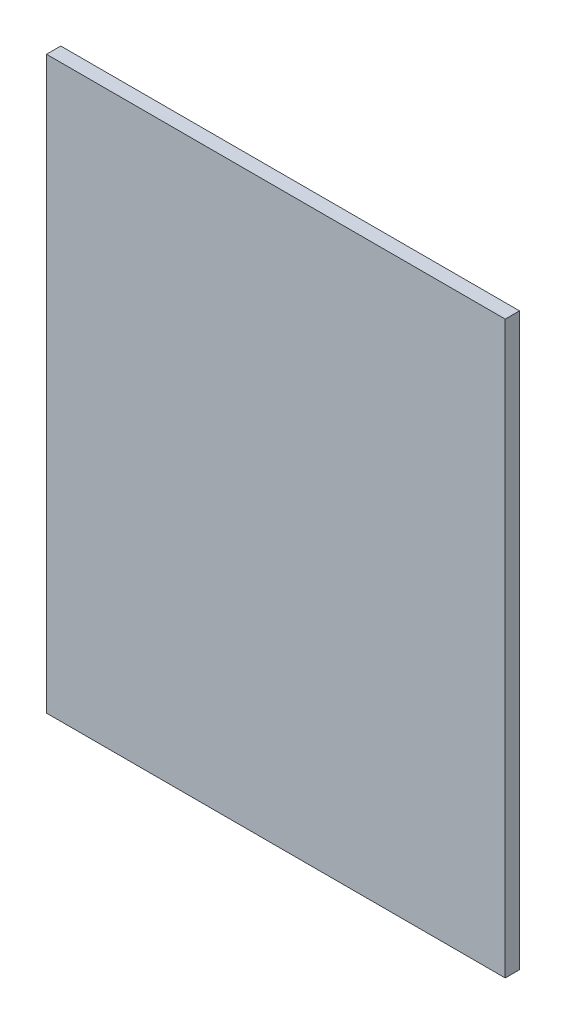
ISO-10303-21;
HEADER;
FILE_DESCRIPTION(('STEP AP214'),'2;1');
FILE_NAME('part.step','',(''),(''),'','','');
FILE_SCHEMA(('AUTOMOTIVE_DESIGN { 1 0 10303 214 1 1 1 1 }'));
ENDSEC;
DATA;
#1=APPLICATION_CONTEXT('core data for automotive mechanical design processes');
#2=APPLICATION_PROTOCOL_DEFINITION('international standard','automotive_design',2000,#1);
#3=PRODUCT_CONTEXT('',#1,'mechanical');
#4=PRODUCT('Part','Part','',(#3));
#5=PRODUCT_RELATED_PRODUCT_CATEGORY('part','',(#4));
#6=PRODUCT_DEFINITION_FORMATION('','',#4);
#7=PRODUCT_DEFINITION_CONTEXT('part definition',#1,'design');
#8=PRODUCT_DEFINITION('design','',#6,#7);
#9=PRODUCT_DEFINITION_SHAPE('','',#8);
#10=(LENGTH_UNIT() NAMED_UNIT(*) SI_UNIT(.MILLI.,.METRE.));
#11=(NAMED_UNIT(*) PLANE_ANGLE_UNIT() SI_UNIT($,.RADIAN.));
#12=(NAMED_UNIT(*) SI_UNIT($,.STERADIAN.) SOLID_ANGLE_UNIT());
#13=UNCERTAINTY_MEASURE_WITH_UNIT(LENGTH_MEASURE(1.E-05),#10,'distance_accuracy_value','');
#14=(GEOMETRIC_REPRESENTATION_CONTEXT(3) GLOBAL_UNCERTAINTY_ASSIGNED_CONTEXT((#13)) GLOBAL_UNIT_ASSIGNED_CONTEXT((#10,
#11,#12)) REPRESENTATION_CONTEXT('',''));
#15=CARTESIAN_POINT('',(0.,0.,0.));
#16=DIRECTION('',(0.,0.,1.));
#17=DIRECTION('',(1.,0.,0.));
#18=AXIS2_PLACEMENT_3D('',#15,#16,#17);
#19=CARTESIAN_POINT('',(-1.99332827989938,100.,0.));
#20=DIRECTION('',(1.,0.,0.));
#21=DIRECTION('',(0.,0.,-1.));
#22=AXIS2_PLACEMENT_3D('',#19,#20,#21);
#23=PLANE('',#22);
#24=DIRECTION('',(0.,0.,1.));
#25=VECTOR('',#24,1.);
#26=CARTESIAN_POINT('',(-1.99332827989938,0.,0.));
#27=LINE('',#26,#25);
#28=CARTESIAN_POINT('',(-1.99332827989938,0.,0.));
#29=VERTEX_POINT('',#28);
#30=CARTESIAN_POINT('',(-1.99332827989938,0.,2.49999999999997));
#31=VERTEX_POINT('',#30);
#32=EDGE_CURVE('E94',#29,#31,#27,.T.);
#33=ORIENTED_EDGE('',*,*,#32,.T.);
#34=DIRECTION('',(0.,-1.,0.));
#35=VECTOR('',#34,1.);
#36=CARTESIAN_POINT('',(-1.99332827989938,100.,2.49999999999997));
#37=LINE('',#36,#35);
#38=CARTESIAN_POINT('',(-1.99332827989938,100.,2.49999999999997));
#39=VERTEX_POINT('',#38);
#40=EDGE_CURVE('E11',#39,#31,#37,.T.);
#41=ORIENTED_EDGE('',*,*,#40,.F.);
#42=DIRECTION('',(0.,0.,1.));
#43=VECTOR('',#42,1.);
#44=CARTESIAN_POINT('',(-1.99332827989938,100.,0.));
#45=LINE('',#44,#43);
#46=CARTESIAN_POINT('',(-1.99332827989938,100.,0.));
#47=VERTEX_POINT('',#46);
#48=EDGE_CURVE('E82',#47,#39,#45,.T.);
#49=ORIENTED_EDGE('',*,*,#48,.F.);
#50=DIRECTION('',(0.,-1.,0.));
#51=VECTOR('',#50,1.);
#52=CARTESIAN_POINT('',(-1.99332827989938,100.,0.));
#53=LINE('',#52,#51);
#54=EDGE_CURVE('E90',#47,#29,#53,.T.);
#55=ORIENTED_EDGE('',*,*,#54,.T.);
#56=EDGE_LOOP('',(#33,#41,#49,#55));
#57=FACE_BOUND('',#56,.T.);
#58=ADVANCED_FACE('F31',(#57),#23,.F.);
#59=CARTESIAN_POINT('',(-1.99332827989938,100.,2.49999999999997));
#60=DIRECTION('',(0.,0.,-1.));
#61=DIRECTION('',(-1.,0.,0.));
#62=AXIS2_PLACEMENT_3D('',#59,#60,#61);
#63=PLANE('',#62);
#64=DIRECTION('',(1.,0.,0.));
#65=VECTOR('',#64,1.);
#66=CARTESIAN_POINT('',(-1.99332827989938,0.,2.49999999999997));
#67=LINE('',#66,#65);
#68=CARTESIAN_POINT('',(78.3969216608551,0.,2.49999999999997));
#69=VERTEX_POINT('',#68);
#70=EDGE_CURVE('E86',#31,#69,#67,.T.);
#71=ORIENTED_EDGE('',*,*,#70,.T.);
#72=DIRECTION('',(0.,-1.,0.));
#73=VECTOR('',#72,1.);
#74=CARTESIAN_POINT('',(78.3969216608551,100.,2.49999999999997));
#75=LINE('',#74,#73);
#76=CARTESIAN_POINT('',(78.3969216608551,100.,2.49999999999997));
#77=VERTEX_POINT('',#76);
#78=EDGE_CURVE('E39',#77,#69,#75,.T.);
#79=ORIENTED_EDGE('',*,*,#78,.F.);
#80=DIRECTION('',(1.,0.,0.));
#81=VECTOR('',#80,1.);
#82=CARTESIAN_POINT('',(-1.99332827989938,100.,2.49999999999997));
#83=LINE('',#82,#81);
#84=EDGE_CURVE('E77',#39,#77,#83,.T.);
#85=ORIENTED_EDGE('',*,*,#84,.F.);
#86=ORIENTED_EDGE('',*,*,#40,.T.);
#87=EDGE_LOOP('',(#71,#79,#85,#86));
#88=FACE_BOUND('',#87,.T.);
#89=ADVANCED_FACE('F85',(#88),#63,.F.);
#90=CARTESIAN_POINT('',(78.3969216608551,100.,2.49999999999997));
#91=DIRECTION('',(-1.,0.,0.));
#92=DIRECTION('',(0.,0.,1.));
#93=AXIS2_PLACEMENT_3D('',#90,#91,#92);
#94=PLANE('',#93);
#95=DIRECTION('',(0.,0.,-1.));
#96=VECTOR('',#95,1.);
#97=CARTESIAN_POINT('',(78.3969216608551,0.,2.49999999999997));
#98=LINE('',#97,#96);
#99=CARTESIAN_POINT('',(78.3969216608551,0.,0.));
#100=VERTEX_POINT('',#99);
#101=EDGE_CURVE('E64',#69,#100,#98,.T.);
#102=ORIENTED_EDGE('',*,*,#101,.T.);
#103=DIRECTION('',(0.,-1.,0.));
#104=VECTOR('',#103,1.);
#105=CARTESIAN_POINT('',(78.3969216608551,100.,0.));
#106=LINE('',#105,#104);
#107=CARTESIAN_POINT('',(78.3969216608551,100.,0.));
#108=VERTEX_POINT('',#107);
#109=EDGE_CURVE('E87',#108,#100,#106,.T.);
#110=ORIENTED_EDGE('',*,*,#109,.F.);
#111=DIRECTION('',(0.,0.,-1.));
#112=VECTOR('',#111,1.);
#113=CARTESIAN_POINT('',(78.3969216608551,100.,2.49999999999997));
#114=LINE('',#113,#112);
#115=EDGE_CURVE('E80',#77,#108,#114,.T.);
#116=ORIENTED_EDGE('',*,*,#115,.F.);
#117=ORIENTED_EDGE('',*,*,#78,.T.);
#118=EDGE_LOOP('',(#102,#110,#116,#117));
#119=FACE_BOUND('',#118,.T.);
#120=ADVANCED_FACE('F88',(#119),#94,.F.);
#121=CARTESIAN_POINT('',(-1.99332827989938,100.,0.));
#122=DIRECTION('',(0.,0.,1.));
#123=DIRECTION('',(1.,0.,0.));
#124=AXIS2_PLACEMENT_3D('',#121,#122,#123);
#125=PLANE('',#124);
#126=DIRECTION('',(-1.,0.,0.));
#127=VECTOR('',#126,1.);
#128=CARTESIAN_POINT('',(-1.99332827989938,0.,0.));
#129=LINE('',#128,#127);
#130=EDGE_CURVE('E70',#100,#29,#129,.T.);
#131=ORIENTED_EDGE('',*,*,#130,.T.);
#132=ORIENTED_EDGE('',*,*,#54,.F.);
#133=DIRECTION('',(-1.,0.,0.));
#134=VECTOR('',#133,1.);
#135=CARTESIAN_POINT('',(-1.99332827989938,100.,0.));
#136=LINE('',#135,#134);
#137=EDGE_CURVE('E47',#108,#47,#136,.T.);
#138=ORIENTED_EDGE('',*,*,#137,.F.);
#139=ORIENTED_EDGE('',*,*,#109,.T.);
#140=EDGE_LOOP('',(#131,#132,#138,#139));
#141=FACE_BOUND('',#140,.T.);
#142=ADVANCED_FACE('F101',(#141),#125,.F.);
#143=CARTESIAN_POINT('',(-1.99332827989938,100.,2.49999999999997));
#144=DIRECTION('',(0.,1.,0.));
#145=DIRECTION('',(0.,0.,1.));
#146=AXIS2_PLACEMENT_3D('',#143,#144,#145);
#147=PLANE('',#146);
#148=ORIENTED_EDGE('',*,*,#48,.T.);
#149=ORIENTED_EDGE('',*,*,#84,.T.);
#150=ORIENTED_EDGE('',*,*,#115,.T.);
#151=ORIENTED_EDGE('',*,*,#137,.T.);
#152=EDGE_LOOP('',(#148,#149,#150,#151));
#153=FACE_BOUND('',#152,.T.);
#154=ADVANCED_FACE('F78',(#153),#147,.T.);
#155=CARTESIAN_POINT('',(-1.99332827989938,0.,2.49999999999997));
#156=DIRECTION('',(0.,1.,0.));
#157=DIRECTION('',(0.,0.,1.));
#158=AXIS2_PLACEMENT_3D('',#155,#156,#157);
#159=PLANE('',#158);
#160=ORIENTED_EDGE('',*,*,#32,.F.);
#161=ORIENTED_EDGE('',*,*,#130,.F.);
#162=ORIENTED_EDGE('',*,*,#101,.F.);
#163=ORIENTED_EDGE('',*,*,#70,.F.);
#164=EDGE_LOOP('',(#160,#161,#162,#163));
#165=FACE_BOUND('',#164,.T.);
#166=ADVANCED_FACE('F104',(#165),#159,.F.);
#167=CLOSED_SHELL('',(#58,#89,#120,#142,#154,#166));
#168=MANIFOLD_SOLID_BREP('B2',#167);
#169=ADVANCED_BREP_SHAPE_REPRESENTATION('',(#18,#168),#14);
#170=SHAPE_DEFINITION_REPRESENTATION(#9,#169);
ENDSEC;
END-ISO-10303-21;
